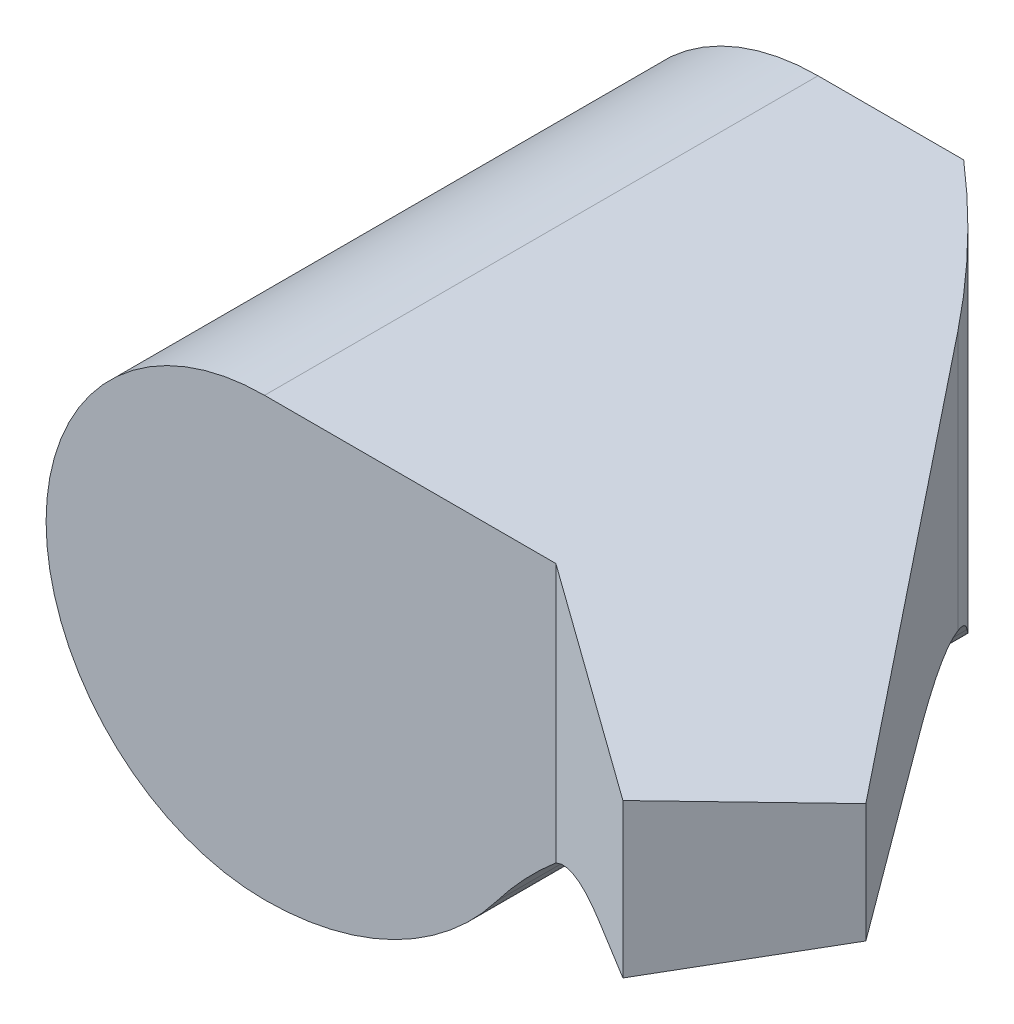
ISO-10303-21;
HEADER;
FILE_DESCRIPTION(('STEP AP214'),'2;1');
FILE_NAME('part.step','',(''),(''),'','','');
FILE_SCHEMA(('AUTOMOTIVE_DESIGN { 1 0 10303 214 1 1 1 1 }'));
ENDSEC;
DATA;
#1=APPLICATION_CONTEXT('core data for automotive mechanical design processes');
#2=APPLICATION_PROTOCOL_DEFINITION('international standard','automotive_design',2000,#1);
#3=PRODUCT_CONTEXT('',#1,'mechanical');
#4=PRODUCT('Part','Part','',(#3));
#5=PRODUCT_RELATED_PRODUCT_CATEGORY('part','',(#4));
#6=PRODUCT_DEFINITION_FORMATION('','',#4);
#7=PRODUCT_DEFINITION_CONTEXT('part definition',#1,'design');
#8=PRODUCT_DEFINITION('design','',#6,#7);
#9=PRODUCT_DEFINITION_SHAPE('','',#8);
#10=(LENGTH_UNIT() NAMED_UNIT(*) SI_UNIT(.MILLI.,.METRE.));
#11=(NAMED_UNIT(*) PLANE_ANGLE_UNIT() SI_UNIT($,.RADIAN.));
#12=(NAMED_UNIT(*) SI_UNIT($,.STERADIAN.) SOLID_ANGLE_UNIT());
#13=UNCERTAINTY_MEASURE_WITH_UNIT(LENGTH_MEASURE(1.E-05),#10,'distance_accuracy_value','');
#14=(GEOMETRIC_REPRESENTATION_CONTEXT(3) GLOBAL_UNCERTAINTY_ASSIGNED_CONTEXT((#13)) GLOBAL_UNIT_ASSIGNED_CONTEXT((#10,
#11,#12)) REPRESENTATION_CONTEXT('',''));
#15=CARTESIAN_POINT('',(0.,0.,0.));
#16=DIRECTION('',(0.,0.,1.));
#17=DIRECTION('',(1.,0.,0.));
#18=AXIS2_PLACEMENT_3D('',#15,#16,#17);
#19=CARTESIAN_POINT('',(-16.0246941986583,11.6736761570341,0.));
#20=DIRECTION('',(0.,0.,1.));
#21=DIRECTION('',(1.,0.,0.));
#22=AXIS2_PLACEMENT_3D('',#19,#20,#21);
#23=PLANE('',#22);
#24=DIRECTION('',(0.,-1.,0.));
#25=VECTOR('',#24,1.);
#26=CARTESIAN_POINT('',(-6.0246941986583,57.6736761570341,0.));
#27=LINE('',#26,#25);
#28=CARTESIAN_POINT('',(-6.02469419865829,26.6736761570341,0.));
#29=VERTEX_POINT('',#28);
#30=CARTESIAN_POINT('',(-6.0246941986583,-0.65221758166226,0.));
#31=VERTEX_POINT('',#30);
#32=EDGE_CURVE('E128',#29,#31,#27,.T.);
#33=ORIENTED_EDGE('',*,*,#32,.T.);
#34=CARTESIAN_POINT('',(-16.0246941986583,16.7085651678595,0.));
#35=DIRECTION('',(0.,0.,1.));
#36=DIRECTION('',(1.,0.,0.));
#37=AXIS2_PLACEMENT_3D('',#34,#35,#36);
#38=CIRCLE('',#37,20.0348890108254);
#39=CARTESIAN_POINT('',(-16.0246941986583,-3.3263238429659,0.));
#40=VERTEX_POINT('',#39);
#41=EDGE_CURVE('E112',#40,#31,#38,.T.);
#42=ORIENTED_EDGE('',*,*,#41,.F.);
#43=CARTESIAN_POINT('',(-16.0246941986583,11.6736761570341,0.));
#44=DIRECTION('',(0.,0.,1.));
#45=DIRECTION('',(1.,0.,0.));
#46=AXIS2_PLACEMENT_3D('',#43,#44,#45);
#47=CIRCLE('',#46,15.);
#48=CARTESIAN_POINT('',(-16.0246941986583,26.6736761570341,0.));
#49=VERTEX_POINT('',#48);
#50=EDGE_CURVE('E127',#49,#40,#47,.T.);
#51=ORIENTED_EDGE('',*,*,#50,.F.);
#52=DIRECTION('',(-1.,0.,0.));
#53=VECTOR('',#52,1.);
#54=CARTESIAN_POINT('',(-16.0246941986583,26.6736761570341,0.));
#55=LINE('',#54,#53);
#56=EDGE_CURVE('E133',#29,#49,#55,.T.);
#57=ORIENTED_EDGE('',*,*,#56,.F.);
#58=EDGE_LOOP('',(#33,#42,#51,#57));
#59=FACE_BOUND('',#58,.T.);
#60=ADVANCED_FACE('F38',(#59),#23,.F.);
#61=CARTESIAN_POINT('',(-16.0246941986583,11.6736761570341,38.));
#62=DIRECTION('',(0.,0.,-1.));
#63=DIRECTION('',(-1.,0.,0.));
#64=AXIS2_PLACEMENT_3D('',#61,#62,#63);
#65=CYLINDRICAL_SURFACE('',#64,15.);
#66=ORIENTED_EDGE('',*,*,#50,.T.);
#67=DIRECTION('',(0.,0.,-1.));
#68=VECTOR('',#67,1.);
#69=CARTESIAN_POINT('',(-16.0246941986583,-3.3263238429659,38.));
#70=LINE('',#69,#68);
#71=CARTESIAN_POINT('',(-16.0246941986583,-3.3263238429659,38.));
#72=VERTEX_POINT('',#71);
#73=EDGE_CURVE('E109',#72,#40,#70,.T.);
#74=ORIENTED_EDGE('',*,*,#73,.F.);
#75=CARTESIAN_POINT('',(-16.0246941986583,11.6736761570341,38.));
#76=DIRECTION('',(0.,0.,1.));
#77=DIRECTION('',(1.,0.,0.));
#78=AXIS2_PLACEMENT_3D('',#75,#76,#77);
#79=CIRCLE('',#78,15.);
#80=CARTESIAN_POINT('',(-16.0246941986583,26.6736761570341,38.));
#81=VERTEX_POINT('',#80);
#82=EDGE_CURVE('E138',#81,#72,#79,.T.);
#83=ORIENTED_EDGE('',*,*,#82,.F.);
#84=DIRECTION('',(0.,0.,-1.));
#85=VECTOR('',#84,1.);
#86=CARTESIAN_POINT('',(-16.0246941986583,26.6736761570341,38.));
#87=LINE('',#86,#85);
#88=EDGE_CURVE('E121',#81,#49,#87,.T.);
#89=ORIENTED_EDGE('',*,*,#88,.T.);
#90=EDGE_LOOP('',(#66,#74,#83,#89));
#91=FACE_BOUND('',#90,.T.);
#92=ADVANCED_FACE('F40',(#91),#65,.T.);
#93=CARTESIAN_POINT('',(-16.0246941986583,26.6736761570341,38.));
#94=DIRECTION('',(0.,-1.,0.));
#95=DIRECTION('',(0.,0.,-1.));
#96=AXIS2_PLACEMENT_3D('',#93,#94,#95);
#97=PLANE('',#96);
#98=DIRECTION('',(0.623678119131016,0.,0.781681267344432));
#99=VECTOR('',#98,1.);
#100=CARTESIAN_POINT('',(3.97530580134171,26.6736761570341,10.4026644788036));
#101=LINE('',#100,#99);
#102=CARTESIAN_POINT('',(3.97530580134171,26.6736761570341,10.4026644788036));
#103=VERTEX_POINT('',#102);
#104=CARTESIAN_POINT('',(28.8945767232462,26.6736761570341,41.635004812747));
#105=VERTEX_POINT('',#104);
#106=EDGE_CURVE('E197',#103,#105,#101,.T.);
#107=ORIENTED_EDGE('',*,*,#106,.F.);
#108=CARTESIAN_POINT('',(-57.2626687561724,26.6736761570341,59.2624573214463));
#109=DIRECTION('',(0.,-1.,0.));
#110=DIRECTION('',(0.,0.,-1.));
#111=AXIS2_PLACEMENT_3D('',#108,#109,#110);
#112=CIRCLE('',#111,78.3413612629543);
#113=EDGE_CURVE('E198',#103,#29,#112,.F.);
#114=ORIENTED_EDGE('',*,*,#113,.T.);
#115=ORIENTED_EDGE('',*,*,#56,.T.);
#116=ORIENTED_EDGE('',*,*,#88,.F.);
#117=DIRECTION('',(-1.,0.,0.));
#118=VECTOR('',#117,1.);
#119=CARTESIAN_POINT('',(-16.0246941986583,26.6736761570341,38.));
#120=LINE('',#119,#118);
#121=CARTESIAN_POINT('',(3.97530580134171,26.6736761570341,38.));
#122=VERTEX_POINT('',#121);
#123=EDGE_CURVE('E63',#122,#81,#120,.T.);
#124=ORIENTED_EDGE('',*,*,#123,.F.);
#125=DIRECTION('',(-0.811828300387876,0.,-0.583896232809678));
#126=VECTOR('',#125,1.);
#127=CARTESIAN_POINT('',(20.3703898997958,26.6736761570341,49.7919365919017));
#128=LINE('',#127,#126);
#129=CARTESIAN_POINT('',(20.3703898997958,26.6736761570341,49.7919365919017));
#130=VERTEX_POINT('',#129);
#131=EDGE_CURVE('E206',#130,#122,#128,.T.);
#132=ORIENTED_EDGE('',*,*,#131,.F.);
#133=DIRECTION('',(-0.722499512565566,0.,0.69137143008843));
#134=VECTOR('',#133,1.);
#135=CARTESIAN_POINT('',(28.8945767232462,26.6736761570341,41.635004812747));
#136=LINE('',#135,#134);
#137=EDGE_CURVE('E201',#105,#130,#136,.T.);
#138=ORIENTED_EDGE('',*,*,#137,.F.);
#139=EDGE_LOOP('',(#107,#114,#115,#116,#124,#132,#138));
#140=FACE_BOUND('',#139,.T.);
#141=ADVANCED_FACE('F184',(#140),#97,.F.);
#142=CARTESIAN_POINT('',(-16.0246941986583,11.6736761570341,38.));
#143=DIRECTION('',(0.,0.,1.));
#144=DIRECTION('',(1.,0.,0.));
#145=AXIS2_PLACEMENT_3D('',#142,#143,#144);
#146=PLANE('',#145);
#147=CARTESIAN_POINT('',(-16.0246941986583,16.7085651678595,38.));
#148=DIRECTION('',(0.,0.,1.));
#149=DIRECTION('',(1.,0.,0.));
#150=AXIS2_PLACEMENT_3D('',#147,#148,#149);
#151=CIRCLE('',#150,20.0348890108254);
#152=CARTESIAN_POINT('',(-0.0727644066886336,4.58698467733918,38.));
#153=VERTEX_POINT('',#152);
#154=EDGE_CURVE('E115',#153,#72,#151,.F.);
#155=ORIENTED_EDGE('',*,*,#154,.F.);
#156=CARTESIAN_POINT('',(21.9103209476968,-12.1175609185989,38.));
#157=DIRECTION('',(0.,0.,1.));
#158=DIRECTION('',(1.,0.,0.));
#159=AXIS2_PLACEMENT_3D('',#156,#157,#158);
#160=CIRCLE('',#159,27.6097425787524);
#161=CARTESIAN_POINT('',(3.97530580134171,8.87370195348632,38.));
#162=VERTEX_POINT('',#161);
#163=EDGE_CURVE('E231',#162,#153,#160,.T.);
#164=ORIENTED_EDGE('',*,*,#163,.F.);
#165=DIRECTION('',(0.,1.,0.));
#166=VECTOR('',#165,1.);
#167=CARTESIAN_POINT('',(3.97530580134171,26.6736761570341,38.));
#168=LINE('',#167,#166);
#169=EDGE_CURVE('E222',#162,#122,#168,.T.);
#170=ORIENTED_EDGE('',*,*,#169,.T.);
#171=ORIENTED_EDGE('',*,*,#123,.T.);
#172=ORIENTED_EDGE('',*,*,#82,.T.);
#173=EDGE_LOOP('',(#155,#164,#170,#171,#172));
#174=FACE_BOUND('',#173,.T.);
#175=ADVANCED_FACE('F186',(#174),#146,.T.);
#176=CARTESIAN_POINT('',(20.3703898997958,26.6736761570341,49.7919365919017));
#177=DIRECTION('',(-0.583896232809678,0.,0.811828300387876));
#178=DIRECTION('',(0.811828300387876,0.,0.583896232809678));
#179=AXIS2_PLACEMENT_3D('',#176,#177,#178);
#180=PLANE('',#179);
#181=DIRECTION('',(-0.79166375561318,-0.221494746840455,-0.56939316396539));
#182=VECTOR('',#181,1.);
#183=CARTESIAN_POINT('',(22.2206884885455,16.6392907948418,51.122738160445));
#184=LINE('',#183,#182);
#185=CARTESIAN_POINT('',(20.3703898997958,16.1216071007374,49.7919365919017));
#186=VERTEX_POINT('',#185);
#187=CARTESIAN_POINT('',(14.4712371693068,14.4711193382898,45.5490529002938));
#188=VERTEX_POINT('',#187);
#189=EDGE_CURVE('E237',#186,#188,#184,.T.);
#190=ORIENTED_EDGE('',*,*,#189,.F.);
#191=DIRECTION('',(0.,-1.,0.));
#192=VECTOR('',#191,1.);
#193=CARTESIAN_POINT('',(20.3703898997958,26.6736761570341,49.7919365919017));
#194=LINE('',#193,#192);
#195=EDGE_CURVE('E134',#130,#186,#194,.T.);
#196=ORIENTED_EDGE('',*,*,#195,.F.);
#197=ORIENTED_EDGE('',*,*,#131,.T.);
#198=ORIENTED_EDGE('',*,*,#169,.F.);
#199=CARTESIAN_POINT('',(21.9103209476968,-12.1175609185989,50.8995106161461));
#200=DIRECTION('',(-0.583896232809678,0.,0.811828300387876));
#201=DIRECTION('',(-0.811828300387876,0.,-0.583896232809678));
#202=AXIS2_PLACEMENT_3D('',#199,#200,#201);
#203=ELLIPSE('',#202,34.0093373999908,27.6097425787524);
#204=EDGE_CURVE('E239',#188,#162,#203,.T.);
#205=ORIENTED_EDGE('',*,*,#204,.F.);
#206=EDGE_LOOP('',(#190,#196,#197,#198,#205));
#207=FACE_BOUND('',#206,.T.);
#208=ADVANCED_FACE('F192',(#207),#180,.T.);
#209=CARTESIAN_POINT('',(28.8945767232462,26.6736761570341,41.635004812747));
#210=DIRECTION('',(0.69137143008843,0.,0.722499512565565));
#211=DIRECTION('',(0.722499512565565,0.,-0.69137143008843));
#212=AXIS2_PLACEMENT_3D('',#209,#210,#211);
#213=PLANE('',#212);
#214=DIRECTION('',(-0.708175609985524,-0.198136110615339,0.677664656811802));
#215=VECTOR('',#214,1.);
#216=CARTESIAN_POINT('',(30.04055016157,18.8271619324466,40.538404356805));
#217=LINE('',#216,#215);
#218=CARTESIAN_POINT('',(28.8945767232462,18.5065370524926,41.635004812747));
#219=VERTEX_POINT('',#218);
#220=EDGE_CURVE('E233',#219,#186,#217,.T.);
#221=ORIENTED_EDGE('',*,*,#220,.F.);
#222=DIRECTION('',(0.,-1.,0.));
#223=VECTOR('',#222,1.);
#224=CARTESIAN_POINT('',(28.8945767232462,26.6736761570341,41.635004812747));
#225=LINE('',#224,#223);
#226=EDGE_CURVE('E141',#105,#219,#225,.T.);
#227=ORIENTED_EDGE('',*,*,#226,.F.);
#228=ORIENTED_EDGE('',*,*,#137,.T.);
#229=ORIENTED_EDGE('',*,*,#195,.T.);
#230=EDGE_LOOP('',(#221,#227,#228,#229));
#231=FACE_BOUND('',#230,.T.);
#232=ADVANCED_FACE('F262',(#231),#213,.T.);
#233=CARTESIAN_POINT('',(3.97530580134171,26.6736761570341,10.4026644788036));
#234=DIRECTION('',(0.781681267344432,0.,-0.623678119131016));
#235=DIRECTION('',(-0.623678119131016,0.,-0.781681267344432));
#236=AXIS2_PLACEMENT_3D('',#233,#234,#235);
#237=PLANE('',#236);
#238=DIRECTION('',(0.614394551066676,0.171897683307813,0.770045792205233));
#239=VECTOR('',#238,1.);
#240=CARTESIAN_POINT('',(5.5741967529963,11.9818709665318,12.4066198318891));
#241=LINE('',#240,#239);
#242=CARTESIAN_POINT('',(14.4712371693068,14.4711193382898,23.5576440780599));
#243=VERTEX_POINT('',#242);
#244=EDGE_CURVE('E11',#243,#219,#241,.T.);
#245=ORIENTED_EDGE('',*,*,#244,.F.);
#246=CARTESIAN_POINT('',(21.9103209476968,-12.1175609185989,32.8813517044803));
#247=DIRECTION('',(0.781681267344432,0.,-0.623678119131016));
#248=DIRECTION('',(-0.623678119131016,0.,-0.781681267344432));
#249=AXIS2_PLACEMENT_3D('',#246,#247,#248);
#250=ELLIPSE('',#249,44.2692179376464,27.6097425787524);
#251=CARTESIAN_POINT('',(3.97530580134168,8.87370195348629,10.4026644788035));
#252=VERTEX_POINT('',#251);
#253=EDGE_CURVE('E255',#252,#243,#250,.T.);
#254=ORIENTED_EDGE('',*,*,#253,.F.);
#255=DIRECTION('',(0.,-1.,0.));
#256=VECTOR('',#255,1.);
#257=CARTESIAN_POINT('',(3.97530580134171,26.6736761570341,10.4026644788036));
#258=LINE('',#257,#256);
#259=EDGE_CURVE('E210',#103,#252,#258,.T.);
#260=ORIENTED_EDGE('',*,*,#259,.F.);
#261=ORIENTED_EDGE('',*,*,#106,.T.);
#262=ORIENTED_EDGE('',*,*,#226,.T.);
#263=EDGE_LOOP('',(#245,#254,#260,#261,#262));
#264=FACE_BOUND('',#263,.T.);
#265=ADVANCED_FACE('F176',(#264),#237,.T.);
#266=CARTESIAN_POINT('',(-57.2626687561724,57.6736761570341,59.2624573214463));
#267=DIRECTION('',(0.,-1.,0.));
#268=DIRECTION('',(1.,0.,0.));
#269=AXIS2_PLACEMENT_3D('',#266,#267,#268);
#270=CYLINDRICAL_SURFACE('',#269,78.3413612629543);
#271=CARTESIAN_POINT('',(3.97530580134168,8.87370195348629,10.4026644788035));
#272=CARTESIAN_POINT('',(3.62848090681206,8.57736983001773,9.9679150110896));
#273=CARTESIAN_POINT('',(3.2817807889273,8.2662772326313,9.54293769012697));
#274=CARTESIAN_POINT('',(2.59306740638035,7.61478574695597,8.71597655661958));
#275=CARTESIAN_POINT('',(2.25104106320291,7.27450706295207,8.31390880360695));
#276=CARTESIAN_POINT('',(1.57329544447201,6.56250128029159,7.5327209021457));
#277=CARTESIAN_POINT('',(1.23757687707243,6.1907706761054,7.15360331974882));
#278=CARTESIAN_POINT('',(0.574704806033394,5.41387896093282,6.41877961190228));
#279=CARTESIAN_POINT('',(0.247590405976431,5.00859150822759,6.06317195582287));
#280=CARTESIAN_POINT('',(-0.0727644066886313,4.58698467733918,5.7210366732266));
#281=B_SPLINE_CURVE_WITH_KNOTS('',3,(#271,#272,#273,#274,#275,#276,#277,#278,#279,#280),
.UNSPECIFIED.,.F.,.F.,(4,2,2,2,4),(0.,1.89043642411778,3.77342999214827,5.65663370973794,
7.54728171096816),.UNSPECIFIED.);
#282=CARTESIAN_POINT('',(-0.0727644066886336,4.58698467733918,5.7210366732266));
#283=VERTEX_POINT('',#282);
#284=EDGE_CURVE('E120',#252,#283,#281,.T.);
#285=ORIENTED_EDGE('',*,*,#284,.T.);
#286=CARTESIAN_POINT('',(-0.0727644066886302,4.58698467733919,5.7210366732266));
#287=CARTESIAN_POINT('',(-0.281512180484357,4.31230471091094,5.49805322917846));
#288=CARTESIAN_POINT('',(-0.495946738951239,4.04480849035954,5.2716305844968));
#289=CARTESIAN_POINT('',(-0.935597132887062,3.52402001977884,4.81311909036382));
#290=CARTESIAN_POINT('',(-1.16081090092506,3.27072506605089,4.58103133162123));
#291=CARTESIAN_POINT('',(-1.61995384849926,2.77973235492737,4.11389651260976));
#292=CARTESIAN_POINT('',(-1.85381399388662,2.54194091541642,3.87887997301127));
#293=CARTESIAN_POINT('',(-2.33121040294086,2.07997576322964,3.40534589228755));
#294=CARTESIAN_POINT('',(-2.57474717486954,1.85580276742641,3.16682816767967));
#295=CARTESIAN_POINT('',(-3.31921037667187,1.20363716082417,2.447426676386));
#296=CARTESIAN_POINT('',(-3.8341769601605,0.795798538367992,1.96250325293637));
#297=CARTESIAN_POINT('',(-4.63412476197611,0.223414735441866,1.23024649462663));
#298=CARTESIAN_POINT('',(-4.90635145538012,0.0386096740348094,0.984486373260585));
#299=CARTESIAN_POINT('',(-5.45924532528173,-0.317180723512185,0.492472504286613));
#300=CARTESIAN_POINT('',(-5.73991230589368,-0.488166380039433,0.246218768258307));
#301=CARTESIAN_POINT('',(-6.02469419865826,-0.652217581662246,0.));
#302=B_SPLINE_CURVE_WITH_KNOTS('',3,(#286,#287,#288,#289,#290,#291,#292,#293,#294,#295,#296,
#297,#298,#299,#300,#301),.UNSPECIFIED.,.F.,.F.,(4,2,2,2,2,2,2,4),(0.,1.23217552009132,
2.46411565107426,3.68774607416632,4.91144085324629,7.35783183532822,8.58961849504819,
9.82137658898753),.UNSPECIFIED.);
#303=EDGE_CURVE('E47',#283,#31,#302,.T.);
#304=ORIENTED_EDGE('',*,*,#303,.T.);
#305=ORIENTED_EDGE('',*,*,#32,.F.);
#306=ORIENTED_EDGE('',*,*,#113,.F.);
#307=ORIENTED_EDGE('',*,*,#259,.T.);
#308=EDGE_LOOP('',(#285,#304,#305,#306,#307));
#309=FACE_BOUND('',#308,.T.);
#310=ADVANCED_FACE('F161',(#309),#270,.T.);
#311=CARTESIAN_POINT('',(-16.0246941986583,16.7085651678595,61.));
#312=DIRECTION('',(0.,0.,-1.));
#313=DIRECTION('',(-1.,0.,0.));
#314=AXIS2_PLACEMENT_3D('',#311,#312,#313);
#315=CYLINDRICAL_SURFACE('',#314,20.0348890108254);
#316=ORIENTED_EDGE('',*,*,#154,.T.);
#317=ORIENTED_EDGE('',*,*,#73,.T.);
#318=ORIENTED_EDGE('',*,*,#41,.T.);
#319=ORIENTED_EDGE('',*,*,#303,.F.);
#320=DIRECTION('',(0.,0.,-1.));
#321=VECTOR('',#320,1.);
#322=CARTESIAN_POINT('',(-0.0727644066886336,4.58698467733918,61.));
#323=LINE('',#322,#321);
#324=EDGE_CURVE('E54',#153,#283,#323,.T.);
#325=ORIENTED_EDGE('',*,*,#324,.F.);
#326=EDGE_LOOP('',(#316,#317,#318,#319,#325));
#327=FACE_BOUND('',#326,.T.);
#328=ADVANCED_FACE('F111',(#327),#315,.T.);
#329=CARTESIAN_POINT('',(14.4712371693068,14.4711193382898,61.));
#330=DIRECTION('',(-0.269436911886131,0.963018042672755,0.));
#331=DIRECTION('',(-0.963018042672756,-0.269436911886131,0.));
#332=AXIS2_PLACEMENT_3D('',#329,#330,#331);
#333=PLANE('',#332);
#334=ORIENTED_EDGE('',*,*,#189,.T.);
#335=DIRECTION('',(0.,0.,-1.));
#336=VECTOR('',#335,1.);
#337=CARTESIAN_POINT('',(14.4712371693068,14.4711193382898,61.));
#338=LINE('',#337,#336);
#339=EDGE_CURVE('E229',#188,#243,#338,.T.);
#340=ORIENTED_EDGE('',*,*,#339,.T.);
#341=ORIENTED_EDGE('',*,*,#244,.T.);
#342=ORIENTED_EDGE('',*,*,#220,.T.);
#343=EDGE_LOOP('',(#334,#340,#341,#342));
#344=FACE_BOUND('',#343,.T.);
#345=ADVANCED_FACE('F168',(#344),#333,.F.);
#346=CARTESIAN_POINT('',(21.9103209476968,-12.1175609185989,61.));
#347=DIRECTION('',(0.,0.,-1.));
#348=DIRECTION('',(-1.,0.,0.));
#349=AXIS2_PLACEMENT_3D('',#346,#347,#348);
#350=CYLINDRICAL_SURFACE('',#349,27.6097425787524);
#351=ORIENTED_EDGE('',*,*,#163,.T.);
#352=ORIENTED_EDGE('',*,*,#324,.T.);
#353=ORIENTED_EDGE('',*,*,#284,.F.);
#354=ORIENTED_EDGE('',*,*,#253,.T.);
#355=ORIENTED_EDGE('',*,*,#339,.F.);
#356=ORIENTED_EDGE('',*,*,#204,.T.);
#357=EDGE_LOOP('',(#351,#352,#353,#354,#355,#356));
#358=FACE_BOUND('',#357,.T.);
#359=ADVANCED_FACE('F164',(#358),#350,.F.);
#360=CLOSED_SHELL('',(#60,#92,#141,#175,#208,#232,#265,#310,#328,#345,#359));
#361=MANIFOLD_SOLID_BREP('B2',#360);
#362=ADVANCED_BREP_SHAPE_REPRESENTATION('',(#18,#361),#14);
#363=SHAPE_DEFINITION_REPRESENTATION(#9,#362);
ENDSEC;
END-ISO-10303-21;
